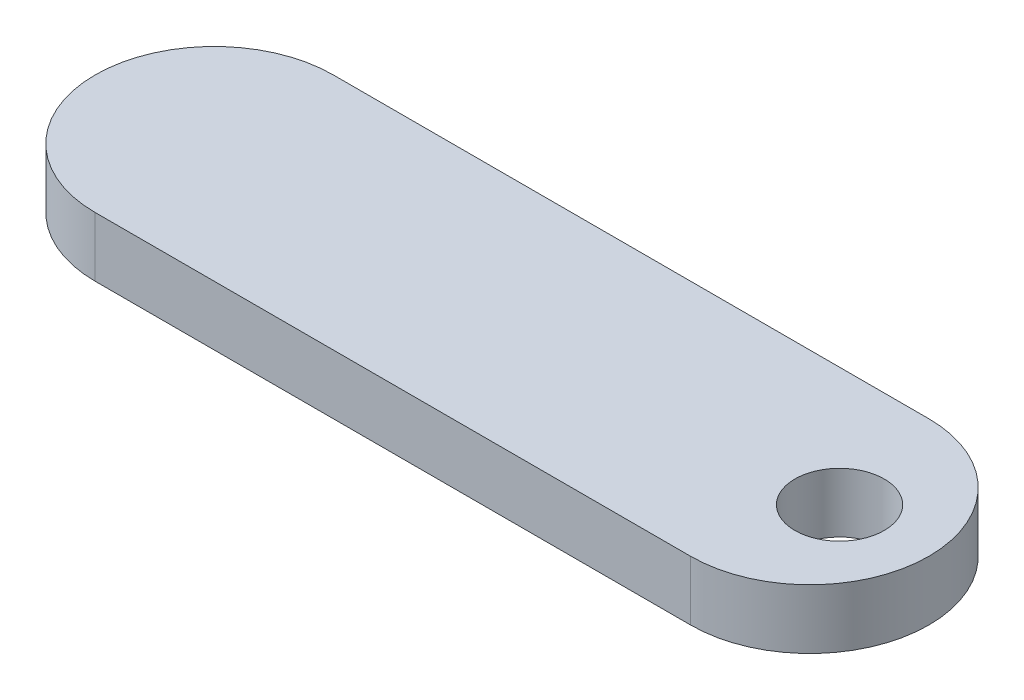
ISO-10303-21;
HEADER;
FILE_DESCRIPTION(('STEP AP214'),'2;1');
FILE_NAME('part.step','',(''),(''),'','','');
FILE_SCHEMA(('AUTOMOTIVE_DESIGN { 1 0 10303 214 1 1 1 1 }'));
ENDSEC;
DATA;
#1=APPLICATION_CONTEXT('core data for automotive mechanical design processes');
#2=APPLICATION_PROTOCOL_DEFINITION('international standard','automotive_design',2000,#1);
#3=PRODUCT_CONTEXT('',#1,'mechanical');
#4=PRODUCT('Part','Part','',(#3));
#5=PRODUCT_RELATED_PRODUCT_CATEGORY('part','',(#4));
#6=PRODUCT_DEFINITION_FORMATION('','',#4);
#7=PRODUCT_DEFINITION_CONTEXT('part definition',#1,'design');
#8=PRODUCT_DEFINITION('design','',#6,#7);
#9=PRODUCT_DEFINITION_SHAPE('','',#8);
#10=(LENGTH_UNIT() NAMED_UNIT(*) SI_UNIT(.MILLI.,.METRE.));
#11=(NAMED_UNIT(*) PLANE_ANGLE_UNIT() SI_UNIT($,.RADIAN.));
#12=(NAMED_UNIT(*) SI_UNIT($,.STERADIAN.) SOLID_ANGLE_UNIT());
#13=UNCERTAINTY_MEASURE_WITH_UNIT(LENGTH_MEASURE(1.E-05),#10,'distance_accuracy_value','');
#14=(GEOMETRIC_REPRESENTATION_CONTEXT(3) GLOBAL_UNCERTAINTY_ASSIGNED_CONTEXT((#13)) GLOBAL_UNIT_ASSIGNED_CONTEXT((#10,
#11,#12)) REPRESENTATION_CONTEXT('',''));
#15=CARTESIAN_POINT('',(0.,0.,0.));
#16=DIRECTION('',(0.,0.,1.));
#17=DIRECTION('',(1.,0.,0.));
#18=AXIS2_PLACEMENT_3D('',#15,#16,#17);
#19=CARTESIAN_POINT('',(-12.7,2.54,0.));
#20=DIRECTION('',(0.,-1.,0.));
#21=DIRECTION('',(0.,0.,-1.));
#22=AXIS2_PLACEMENT_3D('',#19,#20,#21);
#23=CYLINDRICAL_SURFACE('',#22,5.08);
#24=CARTESIAN_POINT('',(-12.7,0.,0.));
#25=DIRECTION('',(0.,1.,0.));
#26=DIRECTION('',(0.,0.,1.));
#27=AXIS2_PLACEMENT_3D('',#24,#25,#26);
#28=CIRCLE('',#27,5.08);
#29=CARTESIAN_POINT('',(-12.7,0.,-5.08));
#30=VERTEX_POINT('',#29);
#31=CARTESIAN_POINT('',(-12.7,0.,5.08));
#32=VERTEX_POINT('',#31);
#33=EDGE_CURVE('E96',#30,#32,#28,.T.);
#34=ORIENTED_EDGE('',*,*,#33,.T.);
#35=DIRECTION('',(0.,-1.,0.));
#36=VECTOR('',#35,1.);
#37=CARTESIAN_POINT('',(-12.7,2.54,5.08));
#38=LINE('',#37,#36);
#39=CARTESIAN_POINT('',(-12.7,2.54,5.08));
#40=VERTEX_POINT('',#39);
#41=EDGE_CURVE('E11',#40,#32,#38,.T.);
#42=ORIENTED_EDGE('',*,*,#41,.F.);
#43=CARTESIAN_POINT('',(-12.7,2.54,0.));
#44=DIRECTION('',(0.,1.,0.));
#45=DIRECTION('',(0.,0.,1.));
#46=AXIS2_PLACEMENT_3D('',#43,#44,#45);
#47=CIRCLE('',#46,5.08);
#48=CARTESIAN_POINT('',(-12.7,2.54,-5.08));
#49=VERTEX_POINT('',#48);
#50=EDGE_CURVE('E84',#49,#40,#47,.T.);
#51=ORIENTED_EDGE('',*,*,#50,.F.);
#52=DIRECTION('',(0.,-1.,0.));
#53=VECTOR('',#52,1.);
#54=CARTESIAN_POINT('',(-12.7,2.54,-5.08));
#55=LINE('',#54,#53);
#56=EDGE_CURVE('E92',#49,#30,#55,.T.);
#57=ORIENTED_EDGE('',*,*,#56,.T.);
#58=EDGE_LOOP('',(#34,#42,#51,#57));
#59=FACE_BOUND('',#58,.T.);
#60=ADVANCED_FACE('F33',(#59),#23,.T.);
#61=CARTESIAN_POINT('',(-12.7,2.54,5.08));
#62=DIRECTION('',(0.,0.,-1.));
#63=DIRECTION('',(-1.,0.,0.));
#64=AXIS2_PLACEMENT_3D('',#61,#62,#63);
#65=PLANE('',#64);
#66=DIRECTION('',(1.,0.,0.));
#67=VECTOR('',#66,1.);
#68=CARTESIAN_POINT('',(-12.7,0.,5.08));
#69=LINE('',#68,#67);
#70=CARTESIAN_POINT('',(12.7,0.,5.07999999999999));
#71=VERTEX_POINT('',#70);
#72=EDGE_CURVE('E88',#32,#71,#69,.T.);
#73=ORIENTED_EDGE('',*,*,#72,.T.);
#74=DIRECTION('',(0.,-1.,0.));
#75=VECTOR('',#74,1.);
#76=CARTESIAN_POINT('',(12.7,2.54,5.07999999999999));
#77=LINE('',#76,#75);
#78=CARTESIAN_POINT('',(12.7,2.54,5.07999999999999));
#79=VERTEX_POINT('',#78);
#80=EDGE_CURVE('E41',#79,#71,#77,.T.);
#81=ORIENTED_EDGE('',*,*,#80,.F.);
#82=DIRECTION('',(1.,0.,0.));
#83=VECTOR('',#82,1.);
#84=CARTESIAN_POINT('',(-12.7,2.54,5.08));
#85=LINE('',#84,#83);
#86=EDGE_CURVE('E79',#40,#79,#85,.T.);
#87=ORIENTED_EDGE('',*,*,#86,.F.);
#88=ORIENTED_EDGE('',*,*,#41,.T.);
#89=EDGE_LOOP('',(#73,#81,#87,#88));
#90=FACE_BOUND('',#89,.T.);
#91=ADVANCED_FACE('F87',(#90),#65,.F.);
#92=CARTESIAN_POINT('',(12.7,2.54,0.));
#93=DIRECTION('',(0.,-1.,0.));
#94=DIRECTION('',(0.,0.,-1.));
#95=AXIS2_PLACEMENT_3D('',#92,#93,#94);
#96=CYLINDRICAL_SURFACE('',#95,5.08);
#97=CARTESIAN_POINT('',(12.7,0.,0.));
#98=DIRECTION('',(0.,1.,0.));
#99=DIRECTION('',(0.,0.,1.));
#100=AXIS2_PLACEMENT_3D('',#97,#98,#99);
#101=CIRCLE('',#100,5.08);
#102=CARTESIAN_POINT('',(12.7,0.,-5.08));
#103=VERTEX_POINT('',#102);
#104=EDGE_CURVE('E66',#71,#103,#101,.T.);
#105=ORIENTED_EDGE('',*,*,#104,.T.);
#106=DIRECTION('',(0.,-1.,0.));
#107=VECTOR('',#106,1.);
#108=CARTESIAN_POINT('',(12.7,2.54,-5.08));
#109=LINE('',#108,#107);
#110=CARTESIAN_POINT('',(12.7,2.54,-5.08));
#111=VERTEX_POINT('',#110);
#112=EDGE_CURVE('E89',#111,#103,#109,.T.);
#113=ORIENTED_EDGE('',*,*,#112,.F.);
#114=CARTESIAN_POINT('',(12.7,2.54,0.));
#115=DIRECTION('',(0.,1.,0.));
#116=DIRECTION('',(0.,0.,1.));
#117=AXIS2_PLACEMENT_3D('',#114,#115,#116);
#118=CIRCLE('',#117,5.08);
#119=EDGE_CURVE('E82',#79,#111,#118,.T.);
#120=ORIENTED_EDGE('',*,*,#119,.F.);
#121=ORIENTED_EDGE('',*,*,#80,.T.);
#122=EDGE_LOOP('',(#105,#113,#120,#121));
#123=FACE_BOUND('',#122,.T.);
#124=ADVANCED_FACE('F90',(#123),#96,.T.);
#125=CARTESIAN_POINT('',(-12.7,2.54,-5.08));
#126=DIRECTION('',(0.,0.,1.));
#127=DIRECTION('',(1.,0.,0.));
#128=AXIS2_PLACEMENT_3D('',#125,#126,#127);
#129=PLANE('',#128);
#130=DIRECTION('',(-1.,0.,0.));
#131=VECTOR('',#130,1.);
#132=CARTESIAN_POINT('',(-12.7,0.,-5.08));
#133=LINE('',#132,#131);
#134=EDGE_CURVE('E72',#103,#30,#133,.T.);
#135=ORIENTED_EDGE('',*,*,#134,.T.);
#136=ORIENTED_EDGE('',*,*,#56,.F.);
#137=DIRECTION('',(-1.,0.,0.));
#138=VECTOR('',#137,1.);
#139=CARTESIAN_POINT('',(-12.7,2.54,-5.08));
#140=LINE('',#139,#138);
#141=EDGE_CURVE('E49',#111,#49,#140,.T.);
#142=ORIENTED_EDGE('',*,*,#141,.F.);
#143=ORIENTED_EDGE('',*,*,#112,.T.);
#144=EDGE_LOOP('',(#135,#136,#142,#143));
#145=FACE_BOUND('',#144,.T.);
#146=ADVANCED_FACE('F104',(#145),#129,.F.);
#147=CARTESIAN_POINT('',(-12.7,2.54,0.));
#148=DIRECTION('',(0.,1.,0.));
#149=DIRECTION('',(0.,0.,1.));
#150=AXIS2_PLACEMENT_3D('',#147,#148,#149);
#151=PLANE('',#150);
#152=CARTESIAN_POINT('',(13.97,2.54,0.));
#153=DIRECTION('',(0.,1.,0.));
#154=DIRECTION('',(0.,0.,1.));
#155=AXIS2_PLACEMENT_3D('',#152,#153,#154);
#156=CIRCLE('',#155,1.905);
#157=CARTESIAN_POINT('',(13.97,2.54,1.905));
#158=VERTEX_POINT('',#157);
#159=EDGE_CURVE('E110',#158,#158,#156,.T.);
#160=ORIENTED_EDGE('',*,*,#159,.F.);
#161=EDGE_LOOP('',(#160));
#162=FACE_BOUND('',#161,.T.);
#163=ORIENTED_EDGE('',*,*,#50,.T.);
#164=ORIENTED_EDGE('',*,*,#86,.T.);
#165=ORIENTED_EDGE('',*,*,#119,.T.);
#166=ORIENTED_EDGE('',*,*,#141,.T.);
#167=EDGE_LOOP('',(#163,#164,#165,#166));
#168=FACE_BOUND('',#167,.T.);
#169=ADVANCED_FACE('F80',(#162,#168),#151,.T.);
#170=CARTESIAN_POINT('',(-12.7,0.,0.));
#171=DIRECTION('',(0.,1.,0.));
#172=DIRECTION('',(0.,0.,1.));
#173=AXIS2_PLACEMENT_3D('',#170,#171,#172);
#174=PLANE('',#173);
#175=CARTESIAN_POINT('',(13.97,0.,0.));
#176=DIRECTION('',(0.,1.,0.));
#177=DIRECTION('',(0.,0.,1.));
#178=AXIS2_PLACEMENT_3D('',#175,#176,#177);
#179=CIRCLE('',#178,1.905);
#180=CARTESIAN_POINT('',(13.97,0.,1.905));
#181=VERTEX_POINT('',#180);
#182=EDGE_CURVE('E99',#181,#181,#179,.T.);
#183=ORIENTED_EDGE('',*,*,#182,.T.);
#184=EDGE_LOOP('',(#183));
#185=FACE_BOUND('',#184,.T.);
#186=ORIENTED_EDGE('',*,*,#33,.F.);
#187=ORIENTED_EDGE('',*,*,#134,.F.);
#188=ORIENTED_EDGE('',*,*,#104,.F.);
#189=ORIENTED_EDGE('',*,*,#72,.F.);
#190=EDGE_LOOP('',(#186,#187,#188,#189));
#191=FACE_BOUND('',#190,.T.);
#192=ADVANCED_FACE('F107',(#185,#191),#174,.F.);
#193=CARTESIAN_POINT('',(13.97,0.,0.));
#194=DIRECTION('',(0.,1.,0.));
#195=DIRECTION('',(0.,0.,1.));
#196=AXIS2_PLACEMENT_3D('',#193,#194,#195);
#197=CYLINDRICAL_SURFACE('',#196,1.905);
#198=ORIENTED_EDGE('',*,*,#182,.F.);
#199=EDGE_LOOP('',(#198));
#200=FACE_BOUND('',#199,.T.);
#201=ORIENTED_EDGE('',*,*,#159,.T.);
#202=EDGE_LOOP('',(#201));
#203=FACE_BOUND('',#202,.T.);
#204=ADVANCED_FACE('F117',(#200,#203),#197,.F.);
#205=CLOSED_SHELL('',(#60,#91,#124,#146,#169,#192,#204));
#206=MANIFOLD_SOLID_BREP('B2',#205);
#207=ADVANCED_BREP_SHAPE_REPRESENTATION('',(#18,#206),#14);
#208=SHAPE_DEFINITION_REPRESENTATION(#9,#207);
ENDSEC;
END-ISO-10303-21;
